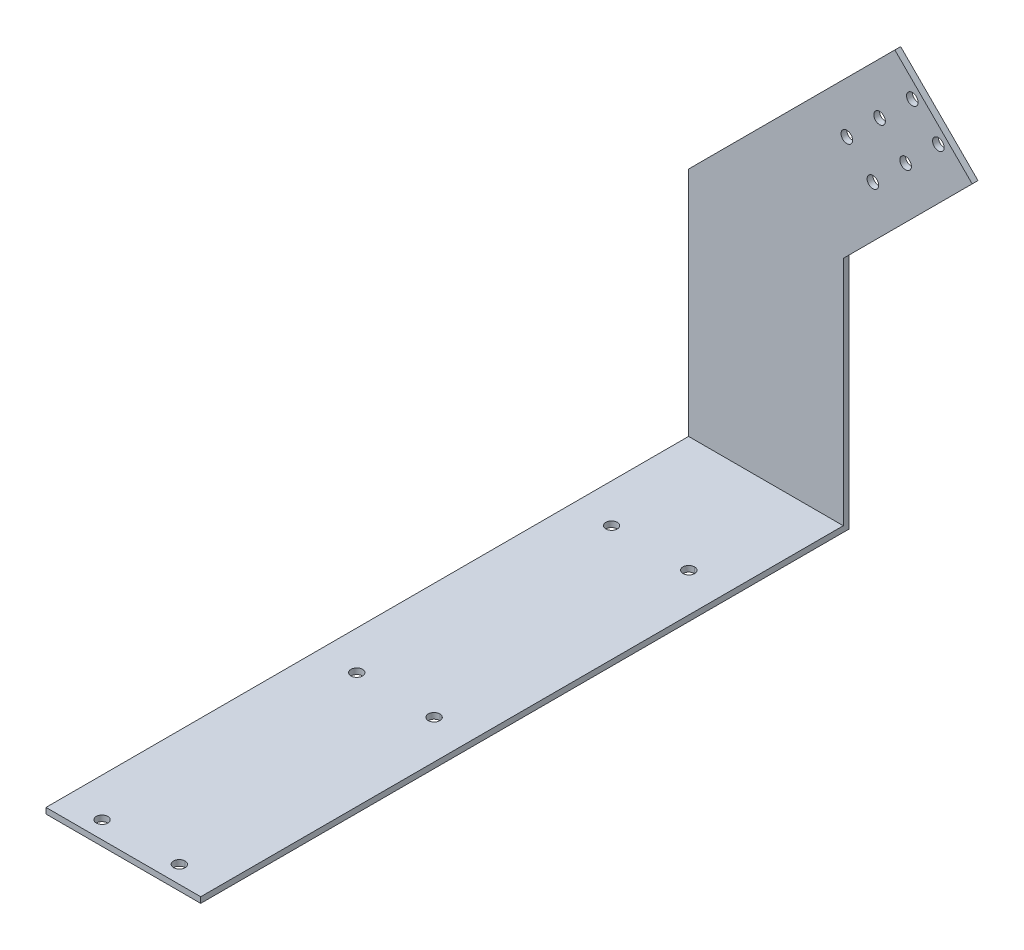
ISO-10303-21;
HEADER;
FILE_DESCRIPTION(('STEP AP214'),'2;1');
FILE_NAME('part.step','',(''),(''),'','','');
FILE_SCHEMA(('AUTOMOTIVE_DESIGN { 1 0 10303 214 1 1 1 1 }'));
ENDSEC;
DATA;
#1=APPLICATION_CONTEXT('core data for automotive mechanical design processes');
#2=APPLICATION_PROTOCOL_DEFINITION('international standard','automotive_design',2000,#1);
#3=PRODUCT_CONTEXT('',#1,'mechanical');
#4=PRODUCT('Part','Part','',(#3));
#5=PRODUCT_RELATED_PRODUCT_CATEGORY('part','',(#4));
#6=PRODUCT_DEFINITION_FORMATION('','',#4);
#7=PRODUCT_DEFINITION_CONTEXT('part definition',#1,'design');
#8=PRODUCT_DEFINITION('design','',#6,#7);
#9=PRODUCT_DEFINITION_SHAPE('','',#8);
#10=(LENGTH_UNIT() NAMED_UNIT(*) SI_UNIT(.MILLI.,.METRE.));
#11=(NAMED_UNIT(*) PLANE_ANGLE_UNIT() SI_UNIT($,.RADIAN.));
#12=(NAMED_UNIT(*) SI_UNIT($,.STERADIAN.) SOLID_ANGLE_UNIT());
#13=UNCERTAINTY_MEASURE_WITH_UNIT(LENGTH_MEASURE(1.E-05),#10,'distance_accuracy_value','');
#14=(GEOMETRIC_REPRESENTATION_CONTEXT(3) GLOBAL_UNCERTAINTY_ASSIGNED_CONTEXT((#13)) GLOBAL_UNIT_ASSIGNED_CONTEXT((#10,
#11,#12)) REPRESENTATION_CONTEXT('',''));
#15=CARTESIAN_POINT('',(0.,0.,0.));
#16=DIRECTION('',(0.,0.,1.));
#17=DIRECTION('',(1.,0.,0.));
#18=AXIS2_PLACEMENT_3D('',#15,#16,#17);
#19=CARTESIAN_POINT('',(329.097072319514,-1126.54768320035,5408.71927487418));
#20=DIRECTION('',(0.,0.,1.));
#21=DIRECTION('',(1.,0.,0.));
#22=AXIS2_PLACEMENT_3D('',#19,#20,#21);
#23=PLANE('',#22);
#24=CARTESIAN_POINT('',(453.746707961516,-846.305090528934,5408.71927487418));
#25=DIRECTION('',(0.,0.,1.));
#26=DIRECTION('',(-1.,0.,0.));
#27=AXIS2_PLACEMENT_3D('',#24,#25,#26);
#28=CIRCLE('',#27,6.35000000000007);
#29=CARTESIAN_POINT('',(447.396707961515,-846.305090528934,5408.71927487418));
#30=VERTEX_POINT('',#29);
#31=EDGE_CURVE('E253',#30,#30,#28,.T.);
#32=ORIENTED_EDGE('',*,*,#31,.F.);
#33=EDGE_LOOP('',(#32));
#34=FACE_BOUND('',#33,.T.);
#35=CARTESIAN_POINT('',(446.421690982894,-910.820649025767,5408.71927487418));
#36=DIRECTION('',(0.,0.,1.));
#37=DIRECTION('',(1.,0.,0.));
#38=AXIS2_PLACEMENT_3D('',#35,#36,#37);
#39=CIRCLE('',#38,6.35000000000007);
#40=CARTESIAN_POINT('',(452.771690982895,-910.820649025767,5408.71927487418));
#41=VERTEX_POINT('',#40);
#42=EDGE_CURVE('E265',#41,#41,#39,.T.);
#43=ORIENTED_EDGE('',*,*,#42,.F.);
#44=EDGE_LOOP('',(#43));
#45=FACE_BOUND('',#44,.T.);
#46=CARTESIAN_POINT('',(518.263739951447,-838.978600057214,5408.71927487418));
#47=DIRECTION('',(0.,0.,1.));
#48=DIRECTION('',(1.,0.,0.));
#49=AXIS2_PLACEMENT_3D('',#46,#47,#48);
#50=CIRCLE('',#49,6.35000000000002);
#51=CARTESIAN_POINT('',(524.613739951447,-838.978600057214,5408.71927487418));
#52=VERTEX_POINT('',#51);
#53=EDGE_CURVE('E121',#52,#52,#50,.T.);
#54=ORIENTED_EDGE('',*,*,#53,.F.);
#55=EDGE_LOOP('',(#54));
#56=FACE_BOUND('',#55,.T.);
#57=DIRECTION('',(0.,-1.,0.));
#58=VECTOR('',#57,1.);
#59=CARTESIAN_POINT('',(244.242072319514,-1253.54768320035,5408.71927487418));
#60=LINE('',#59,#58);
#61=CARTESIAN_POINT('',(244.242072319514,-999.547683200348,5408.71927487418));
#62=VERTEX_POINT('',#61);
#63=CARTESIAN_POINT('',(244.242072319514,-1253.54768320035,5408.71927487418));
#64=VERTEX_POINT('',#63);
#65=EDGE_CURVE('E126',#62,#64,#60,.T.);
#66=ORIENTED_EDGE('',*,*,#65,.T.);
#67=DIRECTION('',(1.,0.,0.));
#68=VECTOR('',#67,1.);
#69=CARTESIAN_POINT('',(413.952072319514,-1253.54768320035,5408.71927487418));
#70=LINE('',#69,#68);
#71=CARTESIAN_POINT('',(413.952072319514,-1253.54768320035,5408.71927487418));
#72=VERTEX_POINT('',#71);
#73=EDGE_CURVE('E282',#64,#72,#70,.T.);
#74=ORIENTED_EDGE('',*,*,#73,.T.);
#75=DIRECTION('',(0.,1.,0.));
#76=VECTOR('',#75,1.);
#77=CARTESIAN_POINT('',(413.952072319514,-1253.54768320035,5408.71927487418));
#78=LINE('',#77,#76);
#79=CARTESIAN_POINT('',(413.952072319514,-999.547683200348,5408.71927487418));
#80=VERTEX_POINT('',#79);
#81=EDGE_CURVE('E103',#72,#80,#78,.T.);
#82=ORIENTED_EDGE('',*,*,#81,.T.);
#83=DIRECTION('',(0.707106781186548,0.707106781186547,0.));
#84=VECTOR('',#83,1.);
#85=CARTESIAN_POINT('',(413.952072319514,-999.547683200348,5408.71927487418));
#86=LINE('',#85,#84);
#87=CARTESIAN_POINT('',(555.373428556824,-858.126326963038,5408.71927487418));
#88=VERTEX_POINT('',#87);
#89=EDGE_CURVE('E97',#80,#88,#86,.T.);
#90=ORIENTED_EDGE('',*,*,#89,.T.);
#91=DIRECTION('',(-0.707124999295898,0.707088562607808,0.));
#92=VECTOR('',#91,1.);
#93=CARTESIAN_POINT('',(470.516242299209,-773.273513220652,5408.71927487418));
#94=LINE('',#93,#92);
#95=CARTESIAN_POINT('',(470.516242299209,-773.273513220652,5408.71927487418));
#96=VERTEX_POINT('',#95);
#97=EDGE_CURVE('E101',#88,#96,#94,.T.);
#98=ORIENTED_EDGE('',*,*,#97,.T.);
#99=DIRECTION('',(-0.707106781186546,-0.707106781186549,0.));
#100=VECTOR('',#99,1.);
#101=CARTESIAN_POINT('',(244.242072319514,-999.547683200348,5408.71927487418));
#102=LINE('',#101,#100);
#103=EDGE_CURVE('E56',#96,#62,#102,.T.);
#104=ORIENTED_EDGE('',*,*,#103,.T.);
#105=EDGE_LOOP('',(#66,#74,#82,#90,#98,#104));
#106=FACE_BOUND('',#105,.T.);
#107=CARTESIAN_POINT('',(482.342715467171,-874.899624541491,5408.71927487418));
#108=DIRECTION('',(0.,0.,1.));
#109=DIRECTION('',(1.,0.,0.));
#110=AXIS2_PLACEMENT_3D('',#107,#108,#109);
#111=CIRCLE('',#110,6.35000000000006);
#112=CARTESIAN_POINT('',(488.692715467171,-874.899624541491,5408.71927487418));
#113=VERTEX_POINT('',#112);
#114=EDGE_CURVE('E271',#113,#113,#111,.T.);
#115=ORIENTED_EDGE('',*,*,#114,.F.);
#116=EDGE_LOOP('',(#115));
#117=FACE_BOUND('',#116,.T.);
#118=CARTESIAN_POINT('',(417.827534508683,-882.227965949275,5408.71927487418));
#119=DIRECTION('',(0.,0.,1.));
#120=DIRECTION('',(-1.,0.,0.));
#121=AXIS2_PLACEMENT_3D('',#118,#119,#120);
#122=CIRCLE('',#121,6.35000000000006);
#123=CARTESIAN_POINT('',(411.477534508683,-882.227965949275,5408.71927487418));
#124=VERTEX_POINT('',#123);
#125=EDGE_CURVE('E259',#124,#124,#122,.T.);
#126=ORIENTED_EDGE('',*,*,#125,.F.);
#127=EDGE_LOOP('',(#126));
#128=FACE_BOUND('',#127,.T.);
#129=CARTESIAN_POINT('',(489.665881414348,-810.382215108593,5408.71927487418));
#130=DIRECTION('',(0.,0.,1.));
#131=DIRECTION('',(-1.,0.,0.));
#132=AXIS2_PLACEMENT_3D('',#129,#130,#131);
#133=CIRCLE('',#132,6.35000000000007);
#134=CARTESIAN_POINT('',(483.315881414348,-810.382215108593,5408.71927487418));
#135=VERTEX_POINT('',#134);
#136=EDGE_CURVE('E247',#135,#135,#133,.T.);
#137=ORIENTED_EDGE('',*,*,#136,.F.);
#138=EDGE_LOOP('',(#137));
#139=FACE_BOUND('',#138,.T.);
#140=ADVANCED_FACE('F39',(#34,#45,#56,#106,#117,#128,#139),#23,.T.);
#141=CARTESIAN_POINT('',(329.097072319514,-1126.54768320035,5402.36927487418));
#142=DIRECTION('',(0.,0.,1.));
#143=DIRECTION('',(1.,0.,0.));
#144=AXIS2_PLACEMENT_3D('',#141,#142,#143);
#145=PLANE('',#144);
#146=DIRECTION('',(0.,-1.,0.));
#147=VECTOR('',#146,1.);
#148=CARTESIAN_POINT('',(244.242072319514,-1253.54768320035,5402.36927487418));
#149=LINE('',#148,#147);
#150=CARTESIAN_POINT('',(244.242072319514,-999.547683200348,5402.36927487418));
#151=VERTEX_POINT('',#150);
#152=CARTESIAN_POINT('',(244.242072319514,-1259.89768320035,5402.36927487418));
#153=VERTEX_POINT('',#152);
#154=EDGE_CURVE('E117',#151,#153,#149,.T.);
#155=ORIENTED_EDGE('',*,*,#154,.F.);
#156=DIRECTION('',(-0.707106781186546,-0.707106781186549,0.));
#157=VECTOR('',#156,1.);
#158=CARTESIAN_POINT('',(244.242072319514,-999.547683200348,5402.36927487418));
#159=LINE('',#158,#157);
#160=CARTESIAN_POINT('',(470.516242299209,-773.273513220652,5402.36927487418));
#161=VERTEX_POINT('',#160);
#162=EDGE_CURVE('E80',#161,#151,#159,.T.);
#163=ORIENTED_EDGE('',*,*,#162,.F.);
#164=DIRECTION('',(-0.707124999295898,0.707088562607808,0.));
#165=VECTOR('',#164,1.);
#166=CARTESIAN_POINT('',(470.516242299209,-773.273513220652,5402.36927487418));
#167=LINE('',#166,#165);
#168=CARTESIAN_POINT('',(555.373428556824,-858.126326963038,5402.36927487418));
#169=VERTEX_POINT('',#168);
#170=EDGE_CURVE('E74',#169,#161,#167,.T.);
#171=ORIENTED_EDGE('',*,*,#170,.F.);
#172=DIRECTION('',(0.707106781186548,0.707106781186547,0.));
#173=VECTOR('',#172,1.);
#174=CARTESIAN_POINT('',(413.952072319514,-999.547683200348,5402.36927487418));
#175=LINE('',#174,#173);
#176=CARTESIAN_POINT('',(413.952072319514,-999.547683200348,5402.36927487418));
#177=VERTEX_POINT('',#176);
#178=EDGE_CURVE('E109',#177,#169,#175,.T.);
#179=ORIENTED_EDGE('',*,*,#178,.F.);
#180=DIRECTION('',(0.,1.,0.));
#181=VECTOR('',#180,1.);
#182=CARTESIAN_POINT('',(413.952072319514,-1253.54768320035,5402.36927487418));
#183=LINE('',#182,#181);
#184=CARTESIAN_POINT('',(413.952072319514,-1259.89768320035,5402.36927487418));
#185=VERTEX_POINT('',#184);
#186=EDGE_CURVE('E120',#185,#177,#183,.T.);
#187=ORIENTED_EDGE('',*,*,#186,.F.);
#188=DIRECTION('',(-1.,0.,0.));
#189=VECTOR('',#188,1.);
#190=CARTESIAN_POINT('',(329.097072319514,-1259.89768320035,5402.36927487418));
#191=LINE('',#190,#189);
#192=EDGE_CURVE('E137',#185,#153,#191,.T.);
#193=ORIENTED_EDGE('',*,*,#192,.T.);
#194=EDGE_LOOP('',(#155,#163,#171,#179,#187,#193));
#195=FACE_BOUND('',#194,.T.);
#196=CARTESIAN_POINT('',(518.263739951447,-838.978600057214,5402.36927487418));
#197=DIRECTION('',(0.,0.,1.));
#198=DIRECTION('',(1.,0.,0.));
#199=AXIS2_PLACEMENT_3D('',#196,#197,#198);
#200=CIRCLE('',#199,6.35000000000002);
#201=CARTESIAN_POINT('',(524.613739951447,-838.978600057214,5402.36927487418));
#202=VERTEX_POINT('',#201);
#203=EDGE_CURVE('E274',#202,#202,#200,.T.);
#204=ORIENTED_EDGE('',*,*,#203,.T.);
#205=EDGE_LOOP('',(#204));
#206=FACE_BOUND('',#205,.T.);
#207=CARTESIAN_POINT('',(482.342715467171,-874.899624541491,5402.36927487418));
#208=DIRECTION('',(0.,0.,1.));
#209=DIRECTION('',(1.,0.,0.));
#210=AXIS2_PLACEMENT_3D('',#207,#208,#209);
#211=CIRCLE('',#210,6.35000000000006);
#212=CARTESIAN_POINT('',(488.692715467171,-874.899624541491,5402.36927487418));
#213=VERTEX_POINT('',#212);
#214=EDGE_CURVE('E268',#213,#213,#211,.T.);
#215=ORIENTED_EDGE('',*,*,#214,.T.);
#216=EDGE_LOOP('',(#215));
#217=FACE_BOUND('',#216,.T.);
#218=CARTESIAN_POINT('',(446.421690982894,-910.820649025767,5402.36927487418));
#219=DIRECTION('',(0.,0.,1.));
#220=DIRECTION('',(1.,0.,0.));
#221=AXIS2_PLACEMENT_3D('',#218,#219,#220);
#222=CIRCLE('',#221,6.35000000000007);
#223=CARTESIAN_POINT('',(452.771690982895,-910.820649025767,5402.36927487418));
#224=VERTEX_POINT('',#223);
#225=EDGE_CURVE('E262',#224,#224,#222,.T.);
#226=ORIENTED_EDGE('',*,*,#225,.T.);
#227=EDGE_LOOP('',(#226));
#228=FACE_BOUND('',#227,.T.);
#229=CARTESIAN_POINT('',(417.827534508683,-882.227965949275,5402.36927487418));
#230=DIRECTION('',(0.,0.,1.));
#231=DIRECTION('',(-1.,0.,0.));
#232=AXIS2_PLACEMENT_3D('',#229,#230,#231);
#233=CIRCLE('',#232,6.35000000000006);
#234=CARTESIAN_POINT('',(411.477534508683,-882.227965949275,5402.36927487418));
#235=VERTEX_POINT('',#234);
#236=EDGE_CURVE('E256',#235,#235,#233,.T.);
#237=ORIENTED_EDGE('',*,*,#236,.T.);
#238=EDGE_LOOP('',(#237));
#239=FACE_BOUND('',#238,.T.);
#240=CARTESIAN_POINT('',(453.746707961516,-846.305090528934,5402.36927487418));
#241=DIRECTION('',(0.,0.,1.));
#242=DIRECTION('',(-1.,0.,0.));
#243=AXIS2_PLACEMENT_3D('',#240,#241,#242);
#244=CIRCLE('',#243,6.35000000000007);
#245=CARTESIAN_POINT('',(447.396707961515,-846.305090528934,5402.36927487418));
#246=VERTEX_POINT('',#245);
#247=EDGE_CURVE('E250',#246,#246,#244,.T.);
#248=ORIENTED_EDGE('',*,*,#247,.T.);
#249=EDGE_LOOP('',(#248));
#250=FACE_BOUND('',#249,.T.);
#251=CARTESIAN_POINT('',(489.665881414348,-810.382215108593,5402.36927487418));
#252=DIRECTION('',(0.,0.,1.));
#253=DIRECTION('',(-1.,0.,0.));
#254=AXIS2_PLACEMENT_3D('',#251,#252,#253);
#255=CIRCLE('',#254,6.35000000000007);
#256=CARTESIAN_POINT('',(483.315881414348,-810.382215108593,5402.36927487418));
#257=VERTEX_POINT('',#256);
#258=EDGE_CURVE('E231',#257,#257,#255,.T.);
#259=ORIENTED_EDGE('',*,*,#258,.T.);
#260=EDGE_LOOP('',(#259));
#261=FACE_BOUND('',#260,.T.);
#262=ADVANCED_FACE('F131',(#195,#206,#217,#228,#239,#250,#261),#145,.F.);
#263=CARTESIAN_POINT('',(244.242072319514,-1253.54768320035,5408.71927487418));
#264=DIRECTION('',(1.,0.,0.));
#265=DIRECTION('',(0.,0.,-1.));
#266=AXIS2_PLACEMENT_3D('',#263,#264,#265);
#267=PLANE('',#266);
#268=ORIENTED_EDGE('',*,*,#154,.T.);
#269=DIRECTION('',(0.,0.,1.));
#270=VECTOR('',#269,1.);
#271=CARTESIAN_POINT('',(244.242072319514,-1259.89768320035,5402.36927487418));
#272=LINE('',#271,#270);
#273=CARTESIAN_POINT('',(244.242072319514,-1259.89768320035,6113.56927487418));
#274=VERTEX_POINT('',#273);
#275=EDGE_CURVE('E143',#153,#274,#272,.T.);
#276=ORIENTED_EDGE('',*,*,#275,.T.);
#277=DIRECTION('',(0.,1.,0.));
#278=VECTOR('',#277,1.);
#279=CARTESIAN_POINT('',(244.242072319514,-1259.89768320035,6113.56927487418));
#280=LINE('',#279,#278);
#281=CARTESIAN_POINT('',(244.242072319514,-1253.54768320035,6113.56927487418));
#282=VERTEX_POINT('',#281);
#283=EDGE_CURVE('E190',#274,#282,#280,.T.);
#284=ORIENTED_EDGE('',*,*,#283,.T.);
#285=DIRECTION('',(0.,0.,1.));
#286=VECTOR('',#285,1.);
#287=CARTESIAN_POINT('',(244.242072319514,-1253.54768320035,5402.36927487418));
#288=LINE('',#287,#286);
#289=EDGE_CURVE('E194',#64,#282,#288,.T.);
#290=ORIENTED_EDGE('',*,*,#289,.F.);
#291=ORIENTED_EDGE('',*,*,#65,.F.);
#292=DIRECTION('',(0.,0.,-1.));
#293=VECTOR('',#292,1.);
#294=CARTESIAN_POINT('',(244.242072319514,-999.547683200348,5408.71927487418));
#295=LINE('',#294,#293);
#296=EDGE_CURVE('E113',#62,#151,#295,.T.);
#297=ORIENTED_EDGE('',*,*,#296,.T.);
#298=EDGE_LOOP('',(#268,#276,#284,#290,#291,#297));
#299=FACE_BOUND('',#298,.T.);
#300=ADVANCED_FACE('F41',(#299),#267,.F.);
#301=CARTESIAN_POINT('',(413.952072319514,-1253.54768320035,5408.71927487418));
#302=DIRECTION('',(-1.,0.,0.));
#303=DIRECTION('',(0.,-1.,0.));
#304=AXIS2_PLACEMENT_3D('',#301,#302,#303);
#305=PLANE('',#304);
#306=ORIENTED_EDGE('',*,*,#186,.T.);
#307=DIRECTION('',(0.,0.,-1.));
#308=VECTOR('',#307,1.);
#309=CARTESIAN_POINT('',(413.952072319514,-999.547683200348,5408.71927487418));
#310=LINE('',#309,#308);
#311=EDGE_CURVE('E11',#80,#177,#310,.T.);
#312=ORIENTED_EDGE('',*,*,#311,.F.);
#313=ORIENTED_EDGE('',*,*,#81,.F.);
#314=DIRECTION('',(0.,0.,1.));
#315=VECTOR('',#314,1.);
#316=CARTESIAN_POINT('',(413.952072319514,-1253.54768320035,5402.36927487418));
#317=LINE('',#316,#315);
#318=CARTESIAN_POINT('',(413.952072319514,-1253.54768320035,6113.56927487418));
#319=VERTEX_POINT('',#318);
#320=EDGE_CURVE('E89',#72,#319,#317,.T.);
#321=ORIENTED_EDGE('',*,*,#320,.T.);
#322=DIRECTION('',(0.,1.,0.));
#323=VECTOR('',#322,1.);
#324=CARTESIAN_POINT('',(413.952072319514,-1259.89768320035,6113.56927487418));
#325=LINE('',#324,#323);
#326=CARTESIAN_POINT('',(413.952072319514,-1259.89768320035,6113.56927487418));
#327=VERTEX_POINT('',#326);
#328=EDGE_CURVE('E241',#327,#319,#325,.T.);
#329=ORIENTED_EDGE('',*,*,#328,.F.);
#330=DIRECTION('',(0.,0.,1.));
#331=VECTOR('',#330,1.);
#332=CARTESIAN_POINT('',(413.952072319514,-1259.89768320035,5402.36927487418));
#333=LINE('',#332,#331);
#334=EDGE_CURVE('E158',#185,#327,#333,.T.);
#335=ORIENTED_EDGE('',*,*,#334,.F.);
#336=EDGE_LOOP('',(#306,#312,#313,#321,#329,#335));
#337=FACE_BOUND('',#336,.T.);
#338=ADVANCED_FACE('F285',(#337),#305,.F.);
#339=CARTESIAN_POINT('',(413.952072319514,-999.547683200348,5408.71927487418));
#340=DIRECTION('',(-0.707106781186547,0.707106781186548,0.));
#341=DIRECTION('',(-0.707106781186548,-0.707106781186547,0.));
#342=AXIS2_PLACEMENT_3D('',#339,#340,#341);
#343=PLANE('',#342);
#344=ORIENTED_EDGE('',*,*,#178,.T.);
#345=DIRECTION('',(0.,0.,-1.));
#346=VECTOR('',#345,1.);
#347=CARTESIAN_POINT('',(555.373428556824,-858.126326963038,5408.71927487418));
#348=LINE('',#347,#346);
#349=EDGE_CURVE('E48',#88,#169,#348,.T.);
#350=ORIENTED_EDGE('',*,*,#349,.F.);
#351=ORIENTED_EDGE('',*,*,#89,.F.);
#352=ORIENTED_EDGE('',*,*,#311,.T.);
#353=EDGE_LOOP('',(#344,#350,#351,#352));
#354=FACE_BOUND('',#353,.T.);
#355=ADVANCED_FACE('F107',(#354),#343,.F.);
#356=CARTESIAN_POINT('',(470.516242299209,-773.273513220652,5408.71927487418));
#357=DIRECTION('',(-0.707088562607808,-0.707124999295899,0.));
#358=DIRECTION('',(0.707124999295899,-0.707088562607808,0.));
#359=AXIS2_PLACEMENT_3D('',#356,#357,#358);
#360=PLANE('',#359);
#361=ORIENTED_EDGE('',*,*,#170,.T.);
#362=DIRECTION('',(0.,0.,-1.));
#363=VECTOR('',#362,1.);
#364=CARTESIAN_POINT('',(470.516242299209,-773.273513220652,5408.71927487418));
#365=LINE('',#364,#363);
#366=EDGE_CURVE('E110',#96,#161,#365,.T.);
#367=ORIENTED_EDGE('',*,*,#366,.F.);
#368=ORIENTED_EDGE('',*,*,#97,.F.);
#369=ORIENTED_EDGE('',*,*,#349,.T.);
#370=EDGE_LOOP('',(#361,#367,#368,#369));
#371=FACE_BOUND('',#370,.T.);
#372=ADVANCED_FACE('F111',(#371),#360,.F.);
#373=CARTESIAN_POINT('',(244.242072319514,-999.547683200348,5408.71927487418));
#374=DIRECTION('',(0.707106781186549,-0.707106781186546,0.));
#375=DIRECTION('',(0.707106781186546,0.707106781186549,0.));
#376=AXIS2_PLACEMENT_3D('',#373,#374,#375);
#377=PLANE('',#376);
#378=ORIENTED_EDGE('',*,*,#162,.T.);
#379=ORIENTED_EDGE('',*,*,#296,.F.);
#380=ORIENTED_EDGE('',*,*,#103,.F.);
#381=ORIENTED_EDGE('',*,*,#366,.T.);
#382=EDGE_LOOP('',(#378,#379,#380,#381));
#383=FACE_BOUND('',#382,.T.);
#384=ADVANCED_FACE('F128',(#383),#377,.F.);
#385=CARTESIAN_POINT('',(518.263739951447,-838.978600057214,5408.71927487418));
#386=DIRECTION('',(0.,0.,-1.));
#387=DIRECTION('',(-1.,0.,0.));
#388=AXIS2_PLACEMENT_3D('',#385,#386,#387);
#389=CYLINDRICAL_SURFACE('',#388,6.35000000000002);
#390=ORIENTED_EDGE('',*,*,#53,.T.);
#391=EDGE_LOOP('',(#390));
#392=FACE_BOUND('',#391,.T.);
#393=ORIENTED_EDGE('',*,*,#203,.F.);
#394=EDGE_LOOP('',(#393));
#395=FACE_BOUND('',#394,.T.);
#396=ADVANCED_FACE('F367',(#392,#395),#389,.F.);
#397=CARTESIAN_POINT('',(482.342715467171,-874.899624541491,5408.71927487418));
#398=DIRECTION('',(0.,0.,-1.));
#399=DIRECTION('',(-1.,0.,0.));
#400=AXIS2_PLACEMENT_3D('',#397,#398,#399);
#401=CYLINDRICAL_SURFACE('',#400,6.35000000000006);
#402=ORIENTED_EDGE('',*,*,#114,.T.);
#403=EDGE_LOOP('',(#402));
#404=FACE_BOUND('',#403,.T.);
#405=ORIENTED_EDGE('',*,*,#214,.F.);
#406=EDGE_LOOP('',(#405));
#407=FACE_BOUND('',#406,.T.);
#408=ADVANCED_FACE('F508',(#404,#407),#401,.F.);
#409=CARTESIAN_POINT('',(446.421690982894,-910.820649025767,5408.71927487418));
#410=DIRECTION('',(0.,0.,-1.));
#411=DIRECTION('',(-1.,0.,0.));
#412=AXIS2_PLACEMENT_3D('',#409,#410,#411);
#413=CYLINDRICAL_SURFACE('',#412,6.35000000000007);
#414=ORIENTED_EDGE('',*,*,#42,.T.);
#415=EDGE_LOOP('',(#414));
#416=FACE_BOUND('',#415,.T.);
#417=ORIENTED_EDGE('',*,*,#225,.F.);
#418=EDGE_LOOP('',(#417));
#419=FACE_BOUND('',#418,.T.);
#420=ADVANCED_FACE('F500',(#416,#419),#413,.F.);
#421=CARTESIAN_POINT('',(417.827534508683,-882.227965949275,5408.71927487418));
#422=DIRECTION('',(0.,0.,-1.));
#423=DIRECTION('',(-1.,0.,0.));
#424=AXIS2_PLACEMENT_3D('',#421,#422,#423);
#425=CYLINDRICAL_SURFACE('',#424,6.35000000000006);
#426=ORIENTED_EDGE('',*,*,#125,.T.);
#427=EDGE_LOOP('',(#426));
#428=FACE_BOUND('',#427,.T.);
#429=ORIENTED_EDGE('',*,*,#236,.F.);
#430=EDGE_LOOP('',(#429));
#431=FACE_BOUND('',#430,.T.);
#432=ADVANCED_FACE('F492',(#428,#431),#425,.F.);
#433=CARTESIAN_POINT('',(453.746707961516,-846.305090528934,5408.71927487418));
#434=DIRECTION('',(0.,0.,-1.));
#435=DIRECTION('',(-1.,0.,0.));
#436=AXIS2_PLACEMENT_3D('',#433,#434,#435);
#437=CYLINDRICAL_SURFACE('',#436,6.35000000000007);
#438=ORIENTED_EDGE('',*,*,#31,.T.);
#439=EDGE_LOOP('',(#438));
#440=FACE_BOUND('',#439,.T.);
#441=ORIENTED_EDGE('',*,*,#247,.F.);
#442=EDGE_LOOP('',(#441));
#443=FACE_BOUND('',#442,.T.);
#444=ADVANCED_FACE('F484',(#440,#443),#437,.F.);
#445=CARTESIAN_POINT('',(489.665881414348,-810.382215108593,5408.71927487418));
#446=DIRECTION('',(0.,0.,-1.));
#447=DIRECTION('',(-1.,0.,0.));
#448=AXIS2_PLACEMENT_3D('',#445,#446,#447);
#449=CYLINDRICAL_SURFACE('',#448,6.35000000000007);
#450=ORIENTED_EDGE('',*,*,#136,.T.);
#451=EDGE_LOOP('',(#450));
#452=FACE_BOUND('',#451,.T.);
#453=ORIENTED_EDGE('',*,*,#258,.F.);
#454=EDGE_LOOP('',(#453));
#455=FACE_BOUND('',#454,.T.);
#456=ADVANCED_FACE('F477',(#452,#455),#449,.F.);
#457=CARTESIAN_POINT('',(371.522072319516,-1259.89768320035,5535.71927487418));
#458=DIRECTION('',(0.,1.,0.));
#459=DIRECTION('',(-1.,0.,0.));
#460=AXIS2_PLACEMENT_3D('',#457,#458,#459);
#461=CYLINDRICAL_SURFACE('',#460,6.34999999999996);
#462=CARTESIAN_POINT('',(371.522072319516,-1253.54768320035,5535.71927487418));
#463=DIRECTION('',(0.,-1.,0.));
#464=DIRECTION('',(1.,0.,0.));
#465=AXIS2_PLACEMENT_3D('',#462,#463,#464);
#466=CIRCLE('',#465,6.34999999999996);
#467=CARTESIAN_POINT('',(371.4720723288,-1253.54768320035,5529.36947172755));
#468=VERTEX_POINT('',#467);
#469=CARTESIAN_POINT('',(371.4720723288,-1253.54768320035,5542.06907802081));
#470=VERTEX_POINT('',#469);
#471=EDGE_CURVE('E213',#468,#470,#466,.T.);
#472=ORIENTED_EDGE('',*,*,#471,.F.);
#473=DIRECTION('',(0.,1.,0.));
#474=VECTOR('',#473,1.);
#475=CARTESIAN_POINT('',(371.4720723288,-1259.89768320035,5529.36947172755));
#476=LINE('',#475,#474);
#477=CARTESIAN_POINT('',(371.4720723288,-1259.89768320035,5529.36947172755));
#478=VERTEX_POINT('',#477);
#479=EDGE_CURVE('E227',#478,#468,#476,.T.);
#480=ORIENTED_EDGE('',*,*,#479,.F.);
#481=CARTESIAN_POINT('',(371.522072319516,-1259.89768320035,5535.71927487418));
#482=DIRECTION('',(0.,-1.,0.));
#483=DIRECTION('',(1.,0.,0.));
#484=AXIS2_PLACEMENT_3D('',#481,#482,#483);
#485=CIRCLE('',#484,6.34999999999996);
#486=CARTESIAN_POINT('',(371.4720723288,-1259.89768320035,5542.06907802081));
#487=VERTEX_POINT('',#486);
#488=EDGE_CURVE('E178',#478,#487,#485,.T.);
#489=ORIENTED_EDGE('',*,*,#488,.T.);
#490=DIRECTION('',(0.,1.,0.));
#491=VECTOR('',#490,1.);
#492=CARTESIAN_POINT('',(371.4720723288,-1259.89768320035,5542.06907802081));
#493=LINE('',#492,#491);
#494=EDGE_CURVE('E224',#487,#470,#493,.T.);
#495=ORIENTED_EDGE('',*,*,#494,.T.);
#496=EDGE_LOOP('',(#472,#480,#489,#495));
#497=FACE_BOUND('',#496,.T.);
#498=ADVANCED_FACE('F327',(#497),#461,.F.);
#499=CARTESIAN_POINT('',(371.422072319668,-1259.89768320035,5815.11927487418));
#500=DIRECTION('',(0.,1.,0.));
#501=DIRECTION('',(-1.,0.,0.));
#502=AXIS2_PLACEMENT_3D('',#499,#500,#501);
#503=CYLINDRICAL_SURFACE('',#502,6.35000000014594);
#504=CARTESIAN_POINT('',(371.422072319668,-1253.54768320035,5815.11927487418));
#505=DIRECTION('',(0.,-1.,0.));
#506=DIRECTION('',(1.,0.,0.));
#507=AXIS2_PLACEMENT_3D('',#504,#505,#506);
#508=CIRCLE('',#507,6.35000000014594);
#509=CARTESIAN_POINT('',(371.472072328811,-1253.54768320035,5821.46907802081));
#510=VERTEX_POINT('',#509);
#511=CARTESIAN_POINT('',(371.472072328793,-1253.54768320035,5808.76947172755));
#512=VERTEX_POINT('',#511);
#513=EDGE_CURVE('E207',#510,#512,#508,.T.);
#514=ORIENTED_EDGE('',*,*,#513,.F.);
#515=DIRECTION('',(0.,1.,0.));
#516=VECTOR('',#515,1.);
#517=CARTESIAN_POINT('',(371.472072328811,-1259.89768320035,5821.46907802081));
#518=LINE('',#517,#516);
#519=CARTESIAN_POINT('',(371.472072328811,-1259.89768320035,5821.46907802081));
#520=VERTEX_POINT('',#519);
#521=EDGE_CURVE('E228',#520,#510,#518,.T.);
#522=ORIENTED_EDGE('',*,*,#521,.F.);
#523=CARTESIAN_POINT('',(371.422072319668,-1259.89768320035,5815.11927487418));
#524=DIRECTION('',(0.,-1.,0.));
#525=DIRECTION('',(1.,0.,0.));
#526=AXIS2_PLACEMENT_3D('',#523,#524,#525);
#527=CIRCLE('',#526,6.35000000014594);
#528=CARTESIAN_POINT('',(371.472072328793,-1259.89768320035,5808.76947172755));
#529=VERTEX_POINT('',#528);
#530=EDGE_CURVE('E172',#520,#529,#527,.T.);
#531=ORIENTED_EDGE('',*,*,#530,.T.);
#532=DIRECTION('',(0.,1.,0.));
#533=VECTOR('',#532,1.);
#534=CARTESIAN_POINT('',(371.472072328793,-1259.89768320035,5808.76947172755));
#535=LINE('',#534,#533);
#536=EDGE_CURVE('E232',#529,#512,#535,.T.);
#537=ORIENTED_EDGE('',*,*,#536,.T.);
#538=EDGE_LOOP('',(#514,#522,#531,#537));
#539=FACE_BOUND('',#538,.T.);
#540=ADVANCED_FACE('F462',(#539),#503,.F.);
#541=CARTESIAN_POINT('',(371.422072319668,-1259.89768320035,6094.51927487418));
#542=DIRECTION('',(0.,1.,0.));
#543=DIRECTION('',(-1.,0.,0.));
#544=AXIS2_PLACEMENT_3D('',#541,#542,#543);
#545=CYLINDRICAL_SURFACE('',#544,6.35000000014688);
#546=CARTESIAN_POINT('',(371.422072319668,-1253.54768320035,6094.51927487418));
#547=DIRECTION('',(0.,-1.,0.));
#548=DIRECTION('',(1.,0.,0.));
#549=AXIS2_PLACEMENT_3D('',#546,#547,#548);
#550=CIRCLE('',#549,6.35000000014688);
#551=CARTESIAN_POINT('',(371.472072328929,-1253.54768320035,6100.86907802081));
#552=VERTEX_POINT('',#551);
#553=CARTESIAN_POINT('',(371.472072328912,-1253.54768320035,6088.16947172755));
#554=VERTEX_POINT('',#553);
#555=EDGE_CURVE('E201',#552,#554,#550,.T.);
#556=ORIENTED_EDGE('',*,*,#555,.F.);
#557=DIRECTION('',(0.,1.,0.));
#558=VECTOR('',#557,1.);
#559=CARTESIAN_POINT('',(371.472072328929,-1259.89768320035,6100.86907802081));
#560=LINE('',#559,#558);
#561=CARTESIAN_POINT('',(371.472072328929,-1259.89768320035,6100.86907802081));
#562=VERTEX_POINT('',#561);
#563=EDGE_CURVE('E235',#562,#552,#560,.T.);
#564=ORIENTED_EDGE('',*,*,#563,.F.);
#565=CARTESIAN_POINT('',(371.422072319668,-1259.89768320035,6094.51927487418));
#566=DIRECTION('',(0.,-1.,0.));
#567=DIRECTION('',(1.,0.,0.));
#568=AXIS2_PLACEMENT_3D('',#565,#566,#567);
#569=CIRCLE('',#568,6.35000000014688);
#570=CARTESIAN_POINT('',(371.472072328912,-1259.89768320035,6088.16947172755));
#571=VERTEX_POINT('',#570);
#572=EDGE_CURVE('E166',#562,#571,#569,.T.);
#573=ORIENTED_EDGE('',*,*,#572,.T.);
#574=DIRECTION('',(0.,1.,0.));
#575=VECTOR('',#574,1.);
#576=CARTESIAN_POINT('',(371.472072328912,-1259.89768320035,6088.16947172755));
#577=LINE('',#576,#575);
#578=EDGE_CURVE('E238',#571,#554,#577,.T.);
#579=ORIENTED_EDGE('',*,*,#578,.T.);
#580=EDGE_LOOP('',(#556,#564,#573,#579));
#581=FACE_BOUND('',#580,.T.);
#582=ADVANCED_FACE('F454',(#581),#545,.F.);
#583=CARTESIAN_POINT('',(286.772072319664,-1259.89768320035,5535.71927487416));
#584=DIRECTION('',(0.,1.,0.));
#585=DIRECTION('',(-1.,0.,0.));
#586=AXIS2_PLACEMENT_3D('',#583,#584,#585);
#587=CYLINDRICAL_SURFACE('',#586,6.35000000013849);
#588=CARTESIAN_POINT('',(286.772072319664,-1259.89768320035,5535.71927487416));
#589=DIRECTION('',(0.,-1.,0.));
#590=DIRECTION('',(1.,0.,0.));
#591=AXIS2_PLACEMENT_3D('',#588,#589,#590);
#592=CIRCLE('',#591,6.35000000013849);
#593=CARTESIAN_POINT('',(293.122072319803,-1259.89768320035,5535.71927487416));
#594=VERTEX_POINT('',#593);
#595=EDGE_CURVE('E184',#594,#594,#592,.F.);
#596=ORIENTED_EDGE('',*,*,#595,.F.);
#597=EDGE_LOOP('',(#596));
#598=FACE_BOUND('',#597,.T.);
#599=CARTESIAN_POINT('',(286.772072319664,-1253.54768320035,5535.71927487416));
#600=DIRECTION('',(0.,-1.,0.));
#601=DIRECTION('',(1.,0.,0.));
#602=AXIS2_PLACEMENT_3D('',#599,#600,#601);
#603=CIRCLE('',#602,6.35000000013849);
#604=CARTESIAN_POINT('',(293.122072319803,-1253.54768320035,5535.71927487416));
#605=VERTEX_POINT('',#604);
#606=EDGE_CURVE('E219',#605,#605,#603,.F.);
#607=ORIENTED_EDGE('',*,*,#606,.T.);
#608=EDGE_LOOP('',(#607));
#609=FACE_BOUND('',#608,.T.);
#610=ADVANCED_FACE('F447',(#598,#609),#587,.F.);
#611=CARTESIAN_POINT('',(371.422072319668,-1259.89768320035,5535.71927487418));
#612=DIRECTION('',(0.,1.,0.));
#613=DIRECTION('',(-1.,0.,0.));
#614=AXIS2_PLACEMENT_3D('',#611,#612,#613);
#615=CYLINDRICAL_SURFACE('',#614,6.35000000014498);
#616=CARTESIAN_POINT('',(371.422072319668,-1253.54768320035,5535.71927487418));
#617=DIRECTION('',(0.,-1.,0.));
#618=DIRECTION('',(1.,0.,0.));
#619=AXIS2_PLACEMENT_3D('',#616,#617,#618);
#620=CIRCLE('',#619,6.35000000014498);
#621=EDGE_CURVE('E216',#470,#468,#620,.T.);
#622=ORIENTED_EDGE('',*,*,#621,.F.);
#623=ORIENTED_EDGE('',*,*,#494,.F.);
#624=CARTESIAN_POINT('',(371.422072319668,-1259.89768320035,5535.71927487418));
#625=DIRECTION('',(0.,-1.,0.));
#626=DIRECTION('',(1.,0.,0.));
#627=AXIS2_PLACEMENT_3D('',#624,#625,#626);
#628=CIRCLE('',#627,6.35000000014498);
#629=EDGE_CURVE('E181',#487,#478,#628,.T.);
#630=ORIENTED_EDGE('',*,*,#629,.T.);
#631=ORIENTED_EDGE('',*,*,#479,.T.);
#632=EDGE_LOOP('',(#622,#623,#630,#631));
#633=FACE_BOUND('',#632,.T.);
#634=ADVANCED_FACE('F335',(#633),#615,.F.);
#635=CARTESIAN_POINT('',(371.522072319515,-1259.89768320035,5815.11927487418));
#636=DIRECTION('',(0.,1.,0.));
#637=DIRECTION('',(-1.,0.,0.));
#638=AXIS2_PLACEMENT_3D('',#635,#636,#637);
#639=CYLINDRICAL_SURFACE('',#638,6.3500000000009);
#640=CARTESIAN_POINT('',(371.522072319515,-1253.54768320035,5815.11927487418));
#641=DIRECTION('',(0.,-1.,0.));
#642=DIRECTION('',(1.,0.,0.));
#643=AXIS2_PLACEMENT_3D('',#640,#641,#642);
#644=CIRCLE('',#643,6.3500000000009);
#645=EDGE_CURVE('E210',#512,#510,#644,.T.);
#646=ORIENTED_EDGE('',*,*,#645,.F.);
#647=ORIENTED_EDGE('',*,*,#536,.F.);
#648=CARTESIAN_POINT('',(371.522072319515,-1259.89768320035,5815.11927487418));
#649=DIRECTION('',(0.,-1.,0.));
#650=DIRECTION('',(1.,0.,0.));
#651=AXIS2_PLACEMENT_3D('',#648,#649,#650);
#652=CIRCLE('',#651,6.3500000000009);
#653=EDGE_CURVE('E175',#529,#520,#652,.T.);
#654=ORIENTED_EDGE('',*,*,#653,.T.);
#655=ORIENTED_EDGE('',*,*,#521,.T.);
#656=EDGE_LOOP('',(#646,#647,#654,#655));
#657=FACE_BOUND('',#656,.T.);
#658=ADVANCED_FACE('F432',(#657),#639,.F.);
#659=CARTESIAN_POINT('',(371.522072319514,-1259.89768320035,6094.51927487418));
#660=DIRECTION('',(0.,1.,0.));
#661=DIRECTION('',(-1.,0.,0.));
#662=AXIS2_PLACEMENT_3D('',#659,#660,#661);
#663=CYLINDRICAL_SURFACE('',#662,6.34999999999996);
#664=CARTESIAN_POINT('',(371.522072319514,-1253.54768320035,6094.51927487418));
#665=DIRECTION('',(0.,-1.,0.));
#666=DIRECTION('',(1.,0.,0.));
#667=AXIS2_PLACEMENT_3D('',#664,#665,#666);
#668=CIRCLE('',#667,6.34999999999996);
#669=EDGE_CURVE('E204',#554,#552,#668,.T.);
#670=ORIENTED_EDGE('',*,*,#669,.F.);
#671=ORIENTED_EDGE('',*,*,#578,.F.);
#672=CARTESIAN_POINT('',(371.522072319514,-1259.89768320035,6094.51927487418));
#673=DIRECTION('',(0.,-1.,0.));
#674=DIRECTION('',(1.,0.,0.));
#675=AXIS2_PLACEMENT_3D('',#672,#673,#674);
#676=CIRCLE('',#675,6.34999999999996);
#677=EDGE_CURVE('E169',#571,#562,#676,.T.);
#678=ORIENTED_EDGE('',*,*,#677,.T.);
#679=ORIENTED_EDGE('',*,*,#563,.T.);
#680=EDGE_LOOP('',(#670,#671,#678,#679));
#681=FACE_BOUND('',#680,.T.);
#682=ADVANCED_FACE('F425',(#681),#663,.F.);
#683=CARTESIAN_POINT('',(329.097072319514,-1259.89768320035,6113.56927487418));
#684=DIRECTION('',(0.,0.,-1.));
#685=DIRECTION('',(-1.,0.,0.));
#686=AXIS2_PLACEMENT_3D('',#683,#684,#685);
#687=PLANE('',#686);
#688=DIRECTION('',(-1.,0.,0.));
#689=VECTOR('',#688,1.);
#690=CARTESIAN_POINT('',(329.097072319514,-1253.54768320035,6113.56927487418));
#691=LINE('',#690,#689);
#692=EDGE_CURVE('E198',#319,#282,#691,.T.);
#693=ORIENTED_EDGE('',*,*,#692,.T.);
#694=ORIENTED_EDGE('',*,*,#283,.F.);
#695=DIRECTION('',(-1.,0.,0.));
#696=VECTOR('',#695,1.);
#697=CARTESIAN_POINT('',(329.097072319514,-1259.89768320035,6113.56927487418));
#698=LINE('',#697,#696);
#699=EDGE_CURVE('E154',#327,#274,#698,.T.);
#700=ORIENTED_EDGE('',*,*,#699,.F.);
#701=ORIENTED_EDGE('',*,*,#328,.T.);
#702=EDGE_LOOP('',(#693,#694,#700,#701));
#703=FACE_BOUND('',#702,.T.);
#704=ADVANCED_FACE('F417',(#703),#687,.F.);
#705=CARTESIAN_POINT('',(286.672072319671,-1259.89768320035,5815.11927487416));
#706=DIRECTION('',(0.,1.,0.));
#707=DIRECTION('',(-1.,0.,0.));
#708=AXIS2_PLACEMENT_3D('',#705,#706,#707);
#709=CYLINDRICAL_SURFACE('',#708,6.35000000014326);
#710=CARTESIAN_POINT('',(286.672072319671,-1259.89768320035,5815.11927487416));
#711=DIRECTION('',(0.,-1.,0.));
#712=DIRECTION('',(1.,0.,0.));
#713=AXIS2_PLACEMENT_3D('',#710,#711,#712);
#714=CIRCLE('',#713,6.35000000014326);
#715=CARTESIAN_POINT('',(293.022072319814,-1259.89768320035,5815.11927487416));
#716=VERTEX_POINT('',#715);
#717=EDGE_CURVE('E156',#716,#716,#714,.F.);
#718=ORIENTED_EDGE('',*,*,#717,.F.);
#719=EDGE_LOOP('',(#718));
#720=FACE_BOUND('',#719,.T.);
#721=CARTESIAN_POINT('',(286.672072319671,-1253.54768320035,5815.11927487416));
#722=DIRECTION('',(0.,-1.,0.));
#723=DIRECTION('',(1.,0.,0.));
#724=AXIS2_PLACEMENT_3D('',#721,#722,#723);
#725=CIRCLE('',#724,6.35000000014326);
#726=CARTESIAN_POINT('',(293.022072319814,-1253.54768320035,5815.11927487416));
#727=VERTEX_POINT('',#726);
#728=EDGE_CURVE('E191',#727,#727,#725,.F.);
#729=ORIENTED_EDGE('',*,*,#728,.T.);
#730=EDGE_LOOP('',(#729));
#731=FACE_BOUND('',#730,.T.);
#732=ADVANCED_FACE('F348',(#720,#731),#709,.F.);
#733=CARTESIAN_POINT('',(286.672072319525,-1259.89768320035,6094.51927487416));
#734=DIRECTION('',(0.,1.,0.));
#735=DIRECTION('',(-1.,0.,0.));
#736=AXIS2_PLACEMENT_3D('',#733,#734,#735);
#737=CYLINDRICAL_SURFACE('',#736,6.35000000000314);
#738=CARTESIAN_POINT('',(286.672072319525,-1259.89768320035,6094.51927487416));
#739=DIRECTION('',(0.,-1.,0.));
#740=DIRECTION('',(1.,0.,0.));
#741=AXIS2_PLACEMENT_3D('',#738,#739,#740);
#742=CIRCLE('',#741,6.35000000000314);
#743=CARTESIAN_POINT('',(293.022072319528,-1259.89768320035,6094.51927487416));
#744=VERTEX_POINT('',#743);
#745=EDGE_CURVE('E187',#744,#744,#742,.F.);
#746=ORIENTED_EDGE('',*,*,#745,.F.);
#747=EDGE_LOOP('',(#746));
#748=FACE_BOUND('',#747,.T.);
#749=CARTESIAN_POINT('',(286.672072319525,-1253.54768320035,6094.51927487416));
#750=DIRECTION('',(0.,-1.,0.));
#751=DIRECTION('',(1.,0.,0.));
#752=AXIS2_PLACEMENT_3D('',#749,#750,#751);
#753=CIRCLE('',#752,6.35000000000314);
#754=CARTESIAN_POINT('',(293.022072319528,-1253.54768320035,6094.51927487416));
#755=VERTEX_POINT('',#754);
#756=EDGE_CURVE('E161',#755,#755,#753,.F.);
#757=ORIENTED_EDGE('',*,*,#756,.T.);
#758=EDGE_LOOP('',(#757));
#759=FACE_BOUND('',#758,.T.);
#760=ADVANCED_FACE('F339',(#748,#759),#737,.F.);
#761=CARTESIAN_POINT('',(329.097072319514,-1259.89768320035,5402.36927487418));
#762=DIRECTION('',(0.,-1.,0.));
#763=DIRECTION('',(1.,0.,0.));
#764=AXIS2_PLACEMENT_3D('',#761,#762,#763);
#765=PLANE('',#764);
#766=ORIENTED_EDGE('',*,*,#717,.T.);
#767=EDGE_LOOP('',(#766));
#768=FACE_BOUND('',#767,.T.);
#769=ORIENTED_EDGE('',*,*,#275,.F.);
#770=ORIENTED_EDGE('',*,*,#192,.F.);
#771=ORIENTED_EDGE('',*,*,#334,.T.);
#772=ORIENTED_EDGE('',*,*,#699,.T.);
#773=EDGE_LOOP('',(#769,#770,#771,#772));
#774=FACE_BOUND('',#773,.T.);
#775=ORIENTED_EDGE('',*,*,#572,.F.);
#776=ORIENTED_EDGE('',*,*,#677,.F.);
#777=EDGE_LOOP('',(#775,#776));
#778=FACE_BOUND('',#777,.T.);
#779=ORIENTED_EDGE('',*,*,#530,.F.);
#780=ORIENTED_EDGE('',*,*,#653,.F.);
#781=EDGE_LOOP('',(#779,#780));
#782=FACE_BOUND('',#781,.T.);
#783=ORIENTED_EDGE('',*,*,#488,.F.);
#784=ORIENTED_EDGE('',*,*,#629,.F.);
#785=EDGE_LOOP('',(#783,#784));
#786=FACE_BOUND('',#785,.T.);
#787=ORIENTED_EDGE('',*,*,#595,.T.);
#788=EDGE_LOOP('',(#787));
#789=FACE_BOUND('',#788,.T.);
#790=ORIENTED_EDGE('',*,*,#745,.T.);
#791=EDGE_LOOP('',(#790));
#792=FACE_BOUND('',#791,.T.);
#793=ADVANCED_FACE('F150',(#768,#774,#778,#782,#786,#789,#792),#765,.T.);
#794=CARTESIAN_POINT('',(329.097072319514,-1253.54768320035,5402.36927487418));
#795=DIRECTION('',(0.,-1.,0.));
#796=DIRECTION('',(1.,0.,0.));
#797=AXIS2_PLACEMENT_3D('',#794,#795,#796);
#798=PLANE('',#797);
#799=ORIENTED_EDGE('',*,*,#73,.F.);
#800=ORIENTED_EDGE('',*,*,#289,.T.);
#801=ORIENTED_EDGE('',*,*,#692,.F.);
#802=ORIENTED_EDGE('',*,*,#320,.F.);
#803=EDGE_LOOP('',(#799,#800,#801,#802));
#804=FACE_BOUND('',#803,.T.);
#805=ORIENTED_EDGE('',*,*,#728,.F.);
#806=EDGE_LOOP('',(#805));
#807=FACE_BOUND('',#806,.T.);
#808=ORIENTED_EDGE('',*,*,#555,.T.);
#809=ORIENTED_EDGE('',*,*,#669,.T.);
#810=EDGE_LOOP('',(#808,#809));
#811=FACE_BOUND('',#810,.T.);
#812=ORIENTED_EDGE('',*,*,#513,.T.);
#813=ORIENTED_EDGE('',*,*,#645,.T.);
#814=EDGE_LOOP('',(#812,#813));
#815=FACE_BOUND('',#814,.T.);
#816=ORIENTED_EDGE('',*,*,#471,.T.);
#817=ORIENTED_EDGE('',*,*,#621,.T.);
#818=EDGE_LOOP('',(#816,#817));
#819=FACE_BOUND('',#818,.T.);
#820=ORIENTED_EDGE('',*,*,#606,.F.);
#821=EDGE_LOOP('',(#820));
#822=FACE_BOUND('',#821,.T.);
#823=ORIENTED_EDGE('',*,*,#756,.F.);
#824=EDGE_LOOP('',(#823));
#825=FACE_BOUND('',#824,.T.);
#826=ADVANCED_FACE('F333',(#804,#807,#811,#815,#819,#822,#825),#798,.F.);
#827=CLOSED_SHELL('',(#140,#262,#300,#338,#355,#372,#384,#396,#408,#420,#432,#444,#456,#498,
#540,#582,#610,#634,#658,#682,#704,#732,#760,#793,#826));
#828=MANIFOLD_SOLID_BREP('B2',#827);
#829=ADVANCED_BREP_SHAPE_REPRESENTATION('',(#18,#828),#14);
#830=SHAPE_DEFINITION_REPRESENTATION(#9,#829);
ENDSEC;
END-ISO-10303-21;
